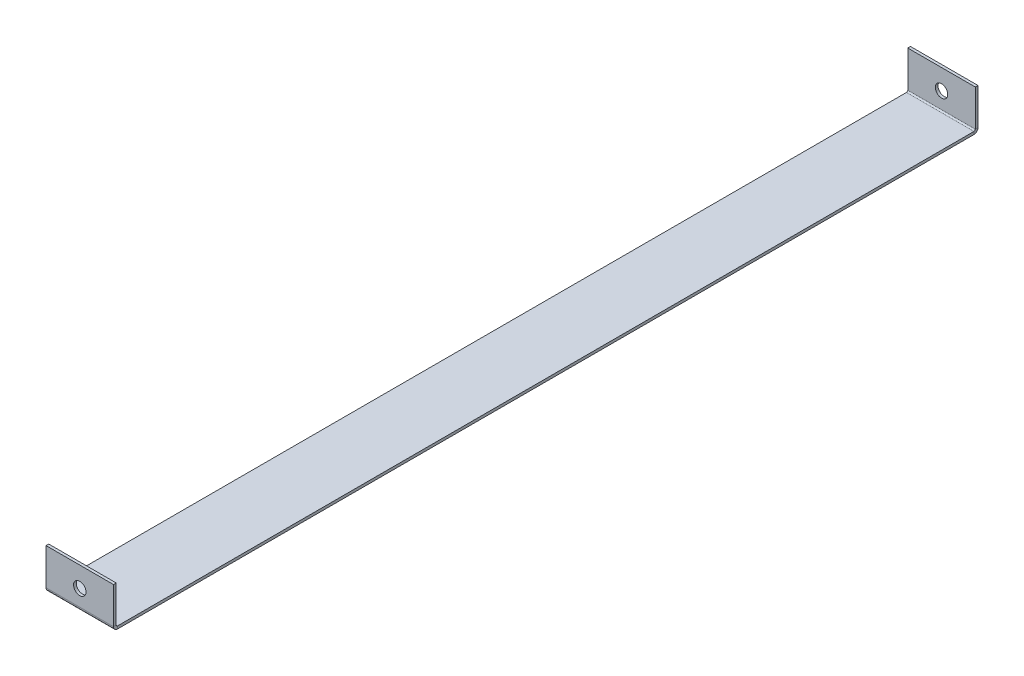
ISO-10303-21;
HEADER;
FILE_DESCRIPTION(('STEP AP214'),'2;1');
FILE_NAME('part.step','',(''),(''),'','','');
FILE_SCHEMA(('AUTOMOTIVE_DESIGN { 1 0 10303 214 1 1 1 1 }'));
ENDSEC;
DATA;
#1=APPLICATION_CONTEXT('core data for automotive mechanical design processes');
#2=APPLICATION_PROTOCOL_DEFINITION('international standard','automotive_design',2000,#1);
#3=PRODUCT_CONTEXT('',#1,'mechanical');
#4=PRODUCT('Part','Part','',(#3));
#5=PRODUCT_RELATED_PRODUCT_CATEGORY('part','',(#4));
#6=PRODUCT_DEFINITION_FORMATION('','',#4);
#7=PRODUCT_DEFINITION_CONTEXT('part definition',#1,'design');
#8=PRODUCT_DEFINITION('design','',#6,#7);
#9=PRODUCT_DEFINITION_SHAPE('','',#8);
#10=(LENGTH_UNIT() NAMED_UNIT(*) SI_UNIT(.MILLI.,.METRE.));
#11=(NAMED_UNIT(*) PLANE_ANGLE_UNIT() SI_UNIT($,.RADIAN.));
#12=(NAMED_UNIT(*) SI_UNIT($,.STERADIAN.) SOLID_ANGLE_UNIT());
#13=UNCERTAINTY_MEASURE_WITH_UNIT(LENGTH_MEASURE(1.E-05),#10,'distance_accuracy_value','');
#14=(GEOMETRIC_REPRESENTATION_CONTEXT(3) GLOBAL_UNCERTAINTY_ASSIGNED_CONTEXT((#13)) GLOBAL_UNIT_ASSIGNED_CONTEXT((#10,
#11,#12)) REPRESENTATION_CONTEXT('',''));
#15=CARTESIAN_POINT('',(0.,0.,0.));
#16=DIRECTION('',(0.,0.,1.));
#17=DIRECTION('',(1.,0.,0.));
#18=AXIS2_PLACEMENT_3D('',#15,#16,#17);
#19=CARTESIAN_POINT('',(-25.,2.,320.));
#20=DIRECTION('',(1.,0.,0.));
#21=DIRECTION('',(0.,0.,-1.));
#22=AXIS2_PLACEMENT_3D('',#19,#20,#21);
#23=PLANE('',#22);
#24=DIRECTION('',(0.,-1.,0.));
#25=VECTOR('',#24,1.);
#26=CARTESIAN_POINT('',(-25.,1.99999999999999,-317.));
#27=LINE('',#26,#25);
#28=CARTESIAN_POINT('',(-25.,2.,-317.));
#29=VERTEX_POINT('',#28);
#30=CARTESIAN_POINT('',(-25.,0.,-317.));
#31=VERTEX_POINT('',#30);
#32=EDGE_CURVE('E213',#29,#31,#27,.T.);
#33=ORIENTED_EDGE('',*,*,#32,.T.);
#34=DIRECTION('',(0.,0.,1.));
#35=VECTOR('',#34,1.);
#36=CARTESIAN_POINT('',(-25.,0.,320.));
#37=LINE('',#36,#35);
#38=CARTESIAN_POINT('',(-25.,0.,317.));
#39=VERTEX_POINT('',#38);
#40=EDGE_CURVE('E277',#31,#39,#37,.T.);
#41=ORIENTED_EDGE('',*,*,#40,.T.);
#42=DIRECTION('',(0.,-1.,0.));
#43=VECTOR('',#42,1.);
#44=CARTESIAN_POINT('',(-25.,2.,317.));
#45=LINE('',#44,#43);
#46=CARTESIAN_POINT('',(-25.,2.,317.));
#47=VERTEX_POINT('',#46);
#48=EDGE_CURVE('E274',#47,#39,#45,.T.);
#49=ORIENTED_EDGE('',*,*,#48,.F.);
#50=DIRECTION('',(0.,0.,1.));
#51=VECTOR('',#50,1.);
#52=CARTESIAN_POINT('',(-25.,2.,320.));
#53=LINE('',#52,#51);
#54=EDGE_CURVE('E82',#29,#47,#53,.T.);
#55=ORIENTED_EDGE('',*,*,#54,.F.);
#56=EDGE_LOOP('',(#33,#41,#49,#55));
#57=FACE_BOUND('',#56,.T.);
#58=ADVANCED_FACE('F74',(#57),#23,.F.);
#59=CARTESIAN_POINT('',(25.,2.,320.));
#60=DIRECTION('',(-1.,0.,0.));
#61=DIRECTION('',(0.,0.,1.));
#62=AXIS2_PLACEMENT_3D('',#59,#60,#61);
#63=PLANE('',#62);
#64=DIRECTION('',(0.,-1.,0.));
#65=VECTOR('',#64,1.);
#66=CARTESIAN_POINT('',(25.,1.99999999999999,-317.));
#67=LINE('',#66,#65);
#68=CARTESIAN_POINT('',(25.,2.,-317.));
#69=VERTEX_POINT('',#68);
#70=CARTESIAN_POINT('',(25.,0.,-317.));
#71=VERTEX_POINT('',#70);
#72=EDGE_CURVE('E90',#69,#71,#67,.T.);
#73=ORIENTED_EDGE('',*,*,#72,.F.);
#74=DIRECTION('',(0.,0.,-1.));
#75=VECTOR('',#74,1.);
#76=CARTESIAN_POINT('',(25.,2.,320.));
#77=LINE('',#76,#75);
#78=CARTESIAN_POINT('',(25.,2.,317.));
#79=VERTEX_POINT('',#78);
#80=EDGE_CURVE('E13',#79,#69,#77,.T.);
#81=ORIENTED_EDGE('',*,*,#80,.F.);
#82=DIRECTION('',(0.,-1.,0.));
#83=VECTOR('',#82,1.);
#84=CARTESIAN_POINT('',(25.,2.,317.));
#85=LINE('',#84,#83);
#86=CARTESIAN_POINT('',(25.,0.,317.));
#87=VERTEX_POINT('',#86);
#88=EDGE_CURVE('E263',#79,#87,#85,.T.);
#89=ORIENTED_EDGE('',*,*,#88,.T.);
#90=DIRECTION('',(0.,0.,-1.));
#91=VECTOR('',#90,1.);
#92=CARTESIAN_POINT('',(25.,0.,320.));
#93=LINE('',#92,#91);
#94=EDGE_CURVE('E279',#87,#71,#93,.T.);
#95=ORIENTED_EDGE('',*,*,#94,.T.);
#96=EDGE_LOOP('',(#73,#81,#89,#95));
#97=FACE_BOUND('',#96,.T.);
#98=ADVANCED_FACE('F282',(#97),#63,.F.);
#99=CARTESIAN_POINT('',(-25.,2.,-320.));
#100=DIRECTION('',(0.,1.,0.));
#101=DIRECTION('',(0.,0.,1.));
#102=AXIS2_PLACEMENT_3D('',#99,#100,#101);
#103=PLANE('',#102);
#104=ORIENTED_EDGE('',*,*,#80,.T.);
#105=DIRECTION('',(-1.,0.,0.));
#106=VECTOR('',#105,1.);
#107=CARTESIAN_POINT('',(-25.,1.99999999999999,-317.));
#108=LINE('',#107,#106);
#109=EDGE_CURVE('E96',#29,#69,#108,.F.);
#110=ORIENTED_EDGE('',*,*,#109,.F.);
#111=ORIENTED_EDGE('',*,*,#54,.T.);
#112=DIRECTION('',(1.,0.,0.));
#113=VECTOR('',#112,1.);
#114=CARTESIAN_POINT('',(25.,2.,317.));
#115=LINE('',#114,#113);
#116=EDGE_CURVE('E269',#79,#47,#115,.F.);
#117=ORIENTED_EDGE('',*,*,#116,.F.);
#118=EDGE_LOOP('',(#104,#110,#111,#117));
#119=FACE_BOUND('',#118,.T.);
#120=ADVANCED_FACE('F374',(#119),#103,.T.);
#121=CARTESIAN_POINT('',(-25.,0.,-320.));
#122=DIRECTION('',(0.,1.,0.));
#123=DIRECTION('',(0.,0.,1.));
#124=AXIS2_PLACEMENT_3D('',#121,#122,#123);
#125=PLANE('',#124);
#126=DIRECTION('',(-1.,0.,0.));
#127=VECTOR('',#126,1.);
#128=CARTESIAN_POINT('',(-25.,0.,-317.));
#129=LINE('',#128,#127);
#130=EDGE_CURVE('E207',#31,#71,#129,.F.);
#131=ORIENTED_EDGE('',*,*,#130,.T.);
#132=ORIENTED_EDGE('',*,*,#94,.F.);
#133=DIRECTION('',(1.,0.,0.));
#134=VECTOR('',#133,1.);
#135=CARTESIAN_POINT('',(25.,0.,317.));
#136=LINE('',#135,#134);
#137=EDGE_CURVE('E256',#87,#39,#136,.F.);
#138=ORIENTED_EDGE('',*,*,#137,.T.);
#139=ORIENTED_EDGE('',*,*,#40,.F.);
#140=EDGE_LOOP('',(#131,#132,#138,#139));
#141=FACE_BOUND('',#140,.T.);
#142=ADVANCED_FACE('F328',(#141),#125,.F.);
#143=CARTESIAN_POINT('',(-25.,3.,317.));
#144=DIRECTION('',(-1.,0.,0.));
#145=DIRECTION('',(0.,0.,1.));
#146=AXIS2_PLACEMENT_3D('',#143,#144,#145);
#147=PLANE('',#146);
#148=DIRECTION('',(0.,0.,-1.));
#149=VECTOR('',#148,1.);
#150=CARTESIAN_POINT('',(-25.,3.,320.));
#151=LINE('',#150,#149);
#152=CARTESIAN_POINT('',(-25.,3.,318.));
#153=VERTEX_POINT('',#152);
#154=CARTESIAN_POINT('',(-25.,3.,320.));
#155=VERTEX_POINT('',#154);
#156=EDGE_CURVE('E224',#153,#155,#151,.F.);
#157=ORIENTED_EDGE('',*,*,#156,.F.);
#158=CARTESIAN_POINT('',(-25.,3.,317.));
#159=DIRECTION('',(1.,0.,0.));
#160=DIRECTION('',(0.,0.,-1.));
#161=AXIS2_PLACEMENT_3D('',#158,#159,#160);
#162=CIRCLE('',#161,1.);
#163=EDGE_CURVE('E266',#47,#153,#162,.F.);
#164=ORIENTED_EDGE('',*,*,#163,.F.);
#165=ORIENTED_EDGE('',*,*,#48,.T.);
#166=CARTESIAN_POINT('',(-25.,3.,317.));
#167=DIRECTION('',(1.,0.,0.));
#168=DIRECTION('',(0.,0.,-1.));
#169=AXIS2_PLACEMENT_3D('',#166,#167,#168);
#170=CIRCLE('',#169,3.);
#171=EDGE_CURVE('E259',#39,#155,#170,.F.);
#172=ORIENTED_EDGE('',*,*,#171,.T.);
#173=EDGE_LOOP('',(#157,#164,#165,#172));
#174=FACE_BOUND('',#173,.T.);
#175=ADVANCED_FACE('F333',(#174),#147,.T.);
#176=CARTESIAN_POINT('',(25.,3.,317.));
#177=DIRECTION('',(-1.,0.,0.));
#178=DIRECTION('',(0.,0.,1.));
#179=AXIS2_PLACEMENT_3D('',#176,#177,#178);
#180=PLANE('',#179);
#181=CARTESIAN_POINT('',(25.,3.,317.));
#182=DIRECTION('',(1.,0.,0.));
#183=DIRECTION('',(0.,0.,-1.));
#184=AXIS2_PLACEMENT_3D('',#181,#182,#183);
#185=CIRCLE('',#184,1.);
#186=CARTESIAN_POINT('',(25.,3.,318.));
#187=VERTEX_POINT('',#186);
#188=EDGE_CURVE('E229',#187,#79,#185,.T.);
#189=ORIENTED_EDGE('',*,*,#188,.F.);
#190=DIRECTION('',(0.,0.,-1.));
#191=VECTOR('',#190,1.);
#192=CARTESIAN_POINT('',(25.,3.,318.));
#193=LINE('',#192,#191);
#194=CARTESIAN_POINT('',(25.,3.,320.));
#195=VERTEX_POINT('',#194);
#196=EDGE_CURVE('E249',#187,#195,#193,.F.);
#197=ORIENTED_EDGE('',*,*,#196,.T.);
#198=CARTESIAN_POINT('',(25.,3.,317.));
#199=DIRECTION('',(1.,0.,0.));
#200=DIRECTION('',(0.,0.,-1.));
#201=AXIS2_PLACEMENT_3D('',#198,#199,#200);
#202=CIRCLE('',#201,3.);
#203=EDGE_CURVE('E260',#195,#87,#202,.T.);
#204=ORIENTED_EDGE('',*,*,#203,.T.);
#205=ORIENTED_EDGE('',*,*,#88,.F.);
#206=EDGE_LOOP('',(#189,#197,#204,#205));
#207=FACE_BOUND('',#206,.T.);
#208=ADVANCED_FACE('F382',(#207),#180,.F.);
#209=CARTESIAN_POINT('',(25.,3.,317.));
#210=DIRECTION('',(1.,0.,0.));
#211=DIRECTION('',(0.,0.,1.));
#212=AXIS2_PLACEMENT_3D('',#209,#210,#211);
#213=CYLINDRICAL_SURFACE('',#212,3.);
#214=ORIENTED_EDGE('',*,*,#137,.F.);
#215=ORIENTED_EDGE('',*,*,#203,.F.);
#216=DIRECTION('',(1.,0.,0.));
#217=VECTOR('',#216,1.);
#218=CARTESIAN_POINT('',(-25.,3.,320.));
#219=LINE('',#218,#217);
#220=EDGE_CURVE('E247',#195,#155,#219,.F.);
#221=ORIENTED_EDGE('',*,*,#220,.T.);
#222=ORIENTED_EDGE('',*,*,#171,.F.);
#223=EDGE_LOOP('',(#214,#215,#221,#222));
#224=FACE_BOUND('',#223,.T.);
#225=ADVANCED_FACE('F334',(#224),#213,.T.);
#226=CARTESIAN_POINT('',(25.,3.,317.));
#227=DIRECTION('',(1.,0.,0.));
#228=DIRECTION('',(0.,0.,1.));
#229=AXIS2_PLACEMENT_3D('',#226,#227,#228);
#230=CYLINDRICAL_SURFACE('',#229,1.);
#231=ORIENTED_EDGE('',*,*,#116,.T.);
#232=ORIENTED_EDGE('',*,*,#163,.T.);
#233=DIRECTION('',(1.,0.,0.));
#234=VECTOR('',#233,1.);
#235=CARTESIAN_POINT('',(-25.,3.,318.));
#236=LINE('',#235,#234);
#237=EDGE_CURVE('E252',#153,#187,#236,.T.);
#238=ORIENTED_EDGE('',*,*,#237,.T.);
#239=ORIENTED_EDGE('',*,*,#188,.T.);
#240=EDGE_LOOP('',(#231,#232,#238,#239));
#241=FACE_BOUND('',#240,.T.);
#242=ADVANCED_FACE('F355',(#241),#230,.F.);
#243=CARTESIAN_POINT('',(-25.,2.,320.));
#244=DIRECTION('',(1.,0.,0.));
#245=DIRECTION('',(0.,1.,0.));
#246=AXIS2_PLACEMENT_3D('',#243,#244,#245);
#247=PLANE('',#246);
#248=ORIENTED_EDGE('',*,*,#156,.T.);
#249=DIRECTION('',(0.,-1.,0.));
#250=VECTOR('',#249,1.);
#251=CARTESIAN_POINT('',(-25.,30.,320.));
#252=LINE('',#251,#250);
#253=CARTESIAN_POINT('',(-25.,30.,320.));
#254=VERTEX_POINT('',#253);
#255=EDGE_CURVE('E237',#254,#155,#252,.T.);
#256=ORIENTED_EDGE('',*,*,#255,.F.);
#257=DIRECTION('',(0.,0.,-1.));
#258=VECTOR('',#257,1.);
#259=CARTESIAN_POINT('',(-25.,30.,320.));
#260=LINE('',#259,#258);
#261=CARTESIAN_POINT('',(-25.,30.,318.));
#262=VERTEX_POINT('',#261);
#263=EDGE_CURVE('E230',#254,#262,#260,.T.);
#264=ORIENTED_EDGE('',*,*,#263,.T.);
#265=DIRECTION('',(0.,1.,0.));
#266=VECTOR('',#265,1.);
#267=CARTESIAN_POINT('',(-25.,2.,318.));
#268=LINE('',#267,#266);
#269=EDGE_CURVE('E244',#262,#153,#268,.F.);
#270=ORIENTED_EDGE('',*,*,#269,.T.);
#271=EDGE_LOOP('',(#248,#256,#264,#270));
#272=FACE_BOUND('',#271,.T.);
#273=ADVANCED_FACE('F352',(#272),#247,.F.);
#274=CARTESIAN_POINT('',(25.,30.,320.));
#275=DIRECTION('',(-1.,0.,0.));
#276=DIRECTION('',(0.,-1.,0.));
#277=AXIS2_PLACEMENT_3D('',#274,#275,#276);
#278=PLANE('',#277);
#279=ORIENTED_EDGE('',*,*,#196,.F.);
#280=DIRECTION('',(0.,-1.,0.));
#281=VECTOR('',#280,1.);
#282=CARTESIAN_POINT('',(25.,30.,318.));
#283=LINE('',#282,#281);
#284=CARTESIAN_POINT('',(25.,30.,318.));
#285=VERTEX_POINT('',#284);
#286=EDGE_CURVE('E242',#187,#285,#283,.F.);
#287=ORIENTED_EDGE('',*,*,#286,.T.);
#288=DIRECTION('',(0.,0.,-1.));
#289=VECTOR('',#288,1.);
#290=CARTESIAN_POINT('',(25.,30.,320.));
#291=LINE('',#290,#289);
#292=CARTESIAN_POINT('',(25.,30.,320.));
#293=VERTEX_POINT('',#292);
#294=EDGE_CURVE('E226',#293,#285,#291,.T.);
#295=ORIENTED_EDGE('',*,*,#294,.F.);
#296=DIRECTION('',(0.,1.,0.));
#297=VECTOR('',#296,1.);
#298=CARTESIAN_POINT('',(25.,30.,320.));
#299=LINE('',#298,#297);
#300=EDGE_CURVE('E235',#195,#293,#299,.T.);
#301=ORIENTED_EDGE('',*,*,#300,.F.);
#302=EDGE_LOOP('',(#279,#287,#295,#301));
#303=FACE_BOUND('',#302,.T.);
#304=ADVANCED_FACE('F343',(#303),#278,.F.);
#305=CARTESIAN_POINT('',(-25.,30.,320.));
#306=DIRECTION('',(0.,0.,-1.));
#307=DIRECTION('',(-1.,0.,0.));
#308=AXIS2_PLACEMENT_3D('',#305,#306,#307);
#309=PLANE('',#308);
#310=CARTESIAN_POINT('',(0.,15.,320.));
#311=DIRECTION('',(0.,0.,1.));
#312=DIRECTION('',(1.,0.,0.));
#313=AXIS2_PLACEMENT_3D('',#310,#311,#312);
#314=CIRCLE('',#313,4.6);
#315=CARTESIAN_POINT('',(4.6,15.,320.));
#316=VERTEX_POINT('',#315);
#317=EDGE_CURVE('E301',#316,#316,#314,.T.);
#318=ORIENTED_EDGE('',*,*,#317,.F.);
#319=EDGE_LOOP('',(#318));
#320=FACE_BOUND('',#319,.T.);
#321=ORIENTED_EDGE('',*,*,#220,.F.);
#322=ORIENTED_EDGE('',*,*,#300,.T.);
#323=DIRECTION('',(-1.,0.,0.));
#324=VECTOR('',#323,1.);
#325=CARTESIAN_POINT('',(-25.,30.,320.));
#326=LINE('',#325,#324);
#327=EDGE_CURVE('E233',#293,#254,#326,.T.);
#328=ORIENTED_EDGE('',*,*,#327,.T.);
#329=ORIENTED_EDGE('',*,*,#255,.T.);
#330=EDGE_LOOP('',(#321,#322,#328,#329));
#331=FACE_BOUND('',#330,.T.);
#332=ADVANCED_FACE('F338',(#320,#331),#309,.F.);
#333=CARTESIAN_POINT('',(-25.,30.,318.));
#334=DIRECTION('',(0.,0.,-1.));
#335=DIRECTION('',(-1.,0.,0.));
#336=AXIS2_PLACEMENT_3D('',#333,#334,#335);
#337=PLANE('',#336);
#338=CARTESIAN_POINT('',(0.,15.,318.));
#339=DIRECTION('',(0.,0.,-1.));
#340=DIRECTION('',(-1.,0.,0.));
#341=AXIS2_PLACEMENT_3D('',#338,#339,#340);
#342=CIRCLE('',#341,4.6);
#343=CARTESIAN_POINT('',(-4.6,15.,318.));
#344=VERTEX_POINT('',#343);
#345=EDGE_CURVE('E206',#344,#344,#342,.T.);
#346=ORIENTED_EDGE('',*,*,#345,.F.);
#347=EDGE_LOOP('',(#346));
#348=FACE_BOUND('',#347,.T.);
#349=ORIENTED_EDGE('',*,*,#286,.F.);
#350=ORIENTED_EDGE('',*,*,#237,.F.);
#351=ORIENTED_EDGE('',*,*,#269,.F.);
#352=DIRECTION('',(1.,0.,0.));
#353=VECTOR('',#352,1.);
#354=CARTESIAN_POINT('',(-25.,30.,318.));
#355=LINE('',#354,#353);
#356=EDGE_CURVE('E240',#285,#262,#355,.F.);
#357=ORIENTED_EDGE('',*,*,#356,.F.);
#358=EDGE_LOOP('',(#349,#350,#351,#357));
#359=FACE_BOUND('',#358,.T.);
#360=ADVANCED_FACE('F358',(#348,#359),#337,.T.);
#361=CARTESIAN_POINT('',(-25.,30.,320.));
#362=DIRECTION('',(0.,-1.,0.));
#363=DIRECTION('',(0.,0.,-1.));
#364=AXIS2_PLACEMENT_3D('',#361,#362,#363);
#365=PLANE('',#364);
#366=ORIENTED_EDGE('',*,*,#356,.T.);
#367=ORIENTED_EDGE('',*,*,#263,.F.);
#368=ORIENTED_EDGE('',*,*,#327,.F.);
#369=ORIENTED_EDGE('',*,*,#294,.T.);
#370=EDGE_LOOP('',(#366,#367,#368,#369));
#371=FACE_BOUND('',#370,.T.);
#372=ADVANCED_FACE('F349',(#371),#365,.F.);
#373=CARTESIAN_POINT('',(25.,3.,-317.));
#374=DIRECTION('',(1.,0.,0.));
#375=DIRECTION('',(0.,0.,-1.));
#376=AXIS2_PLACEMENT_3D('',#373,#374,#375);
#377=PLANE('',#376);
#378=DIRECTION('',(0.,0.,1.));
#379=VECTOR('',#378,1.);
#380=CARTESIAN_POINT('',(25.,3.00000000000002,-320.));
#381=LINE('',#380,#379);
#382=CARTESIAN_POINT('',(25.,2.99999999999999,-318.));
#383=VERTEX_POINT('',#382);
#384=CARTESIAN_POINT('',(25.,2.99999999999998,-320.));
#385=VERTEX_POINT('',#384);
#386=EDGE_CURVE('E189',#383,#385,#381,.F.);
#387=ORIENTED_EDGE('',*,*,#386,.F.);
#388=CARTESIAN_POINT('',(25.,3.,-317.));
#389=DIRECTION('',(-1.,0.,0.));
#390=DIRECTION('',(0.,0.,1.));
#391=AXIS2_PLACEMENT_3D('',#388,#389,#390);
#392=CIRCLE('',#391,1.);
#393=EDGE_CURVE('E216',#69,#383,#392,.F.);
#394=ORIENTED_EDGE('',*,*,#393,.F.);
#395=ORIENTED_EDGE('',*,*,#72,.T.);
#396=CARTESIAN_POINT('',(25.,3.,-317.));
#397=DIRECTION('',(-1.,0.,0.));
#398=DIRECTION('',(0.,0.,1.));
#399=AXIS2_PLACEMENT_3D('',#396,#397,#398);
#400=CIRCLE('',#399,3.);
#401=EDGE_CURVE('E209',#71,#385,#400,.F.);
#402=ORIENTED_EDGE('',*,*,#401,.T.);
#403=EDGE_LOOP('',(#387,#394,#395,#402));
#404=FACE_BOUND('',#403,.T.);
#405=ADVANCED_FACE('F289',(#404),#377,.T.);
#406=CARTESIAN_POINT('',(-25.,3.,-317.));
#407=DIRECTION('',(1.,0.,0.));
#408=DIRECTION('',(0.,0.,-1.));
#409=AXIS2_PLACEMENT_3D('',#406,#407,#408);
#410=PLANE('',#409);
#411=CARTESIAN_POINT('',(-25.,3.,-317.));
#412=DIRECTION('',(-1.,0.,0.));
#413=DIRECTION('',(0.,0.,1.));
#414=AXIS2_PLACEMENT_3D('',#411,#412,#413);
#415=CIRCLE('',#414,1.);
#416=CARTESIAN_POINT('',(-25.,2.99999999999999,-318.));
#417=VERTEX_POINT('',#416);
#418=EDGE_CURVE('E220',#417,#29,#415,.T.);
#419=ORIENTED_EDGE('',*,*,#418,.F.);
#420=DIRECTION('',(0.,0.,1.));
#421=VECTOR('',#420,1.);
#422=CARTESIAN_POINT('',(-25.,3.,-318.));
#423=LINE('',#422,#421);
#424=CARTESIAN_POINT('',(-25.,3.00000000000002,-320.));
#425=VERTEX_POINT('',#424);
#426=EDGE_CURVE('E200',#417,#425,#423,.F.);
#427=ORIENTED_EDGE('',*,*,#426,.T.);
#428=CARTESIAN_POINT('',(-25.,3.,-317.));
#429=DIRECTION('',(-1.,0.,0.));
#430=DIRECTION('',(0.,0.,1.));
#431=AXIS2_PLACEMENT_3D('',#428,#429,#430);
#432=CIRCLE('',#431,3.);
#433=EDGE_CURVE('E210',#425,#31,#432,.T.);
#434=ORIENTED_EDGE('',*,*,#433,.T.);
#435=ORIENTED_EDGE('',*,*,#32,.F.);
#436=EDGE_LOOP('',(#419,#427,#434,#435));
#437=FACE_BOUND('',#436,.T.);
#438=ADVANCED_FACE('F324',(#437),#410,.F.);
#439=CARTESIAN_POINT('',(-25.,3.,-317.));
#440=DIRECTION('',(-1.,0.,0.));
#441=DIRECTION('',(0.,0.,-1.));
#442=AXIS2_PLACEMENT_3D('',#439,#440,#441);
#443=CYLINDRICAL_SURFACE('',#442,3.);
#444=ORIENTED_EDGE('',*,*,#130,.F.);
#445=ORIENTED_EDGE('',*,*,#433,.F.);
#446=DIRECTION('',(-1.,0.,0.));
#447=VECTOR('',#446,1.);
#448=CARTESIAN_POINT('',(25.,3.00000000000002,-320.));
#449=LINE('',#448,#447);
#450=EDGE_CURVE('E198',#425,#385,#449,.F.);
#451=ORIENTED_EDGE('',*,*,#450,.T.);
#452=ORIENTED_EDGE('',*,*,#401,.F.);
#453=EDGE_LOOP('',(#444,#445,#451,#452));
#454=FACE_BOUND('',#453,.T.);
#455=ADVANCED_FACE('F292',(#454),#443,.T.);
#456=CARTESIAN_POINT('',(-25.,3.,-317.));
#457=DIRECTION('',(-1.,0.,0.));
#458=DIRECTION('',(0.,0.,-1.));
#459=AXIS2_PLACEMENT_3D('',#456,#457,#458);
#460=CYLINDRICAL_SURFACE('',#459,1.);
#461=ORIENTED_EDGE('',*,*,#109,.T.);
#462=ORIENTED_EDGE('',*,*,#393,.T.);
#463=DIRECTION('',(-1.,0.,0.));
#464=VECTOR('',#463,1.);
#465=CARTESIAN_POINT('',(25.,3.,-318.));
#466=LINE('',#465,#464);
#467=EDGE_CURVE('E203',#383,#417,#466,.T.);
#468=ORIENTED_EDGE('',*,*,#467,.T.);
#469=ORIENTED_EDGE('',*,*,#418,.T.);
#470=EDGE_LOOP('',(#461,#462,#468,#469));
#471=FACE_BOUND('',#470,.T.);
#472=ADVANCED_FACE('F321',(#471),#460,.F.);
#473=CARTESIAN_POINT('',(25.,1.99999999999999,-320.));
#474=DIRECTION('',(-1.,0.,0.));
#475=DIRECTION('',(0.,0.,1.));
#476=AXIS2_PLACEMENT_3D('',#473,#474,#475);
#477=PLANE('',#476);
#478=ORIENTED_EDGE('',*,*,#386,.T.);
#479=DIRECTION('',(0.,-1.,0.));
#480=VECTOR('',#479,1.);
#481=CARTESIAN_POINT('',(25.,30.,-320.));
#482=LINE('',#481,#480);
#483=CARTESIAN_POINT('',(25.,30.,-320.));
#484=VERTEX_POINT('',#483);
#485=EDGE_CURVE('E170',#484,#385,#482,.T.);
#486=ORIENTED_EDGE('',*,*,#485,.F.);
#487=DIRECTION('',(0.,0.,1.));
#488=VECTOR('',#487,1.);
#489=CARTESIAN_POINT('',(25.,30.,-320.));
#490=LINE('',#489,#488);
#491=CARTESIAN_POINT('',(25.,30.,-318.));
#492=VERTEX_POINT('',#491);
#493=EDGE_CURVE('E176',#484,#492,#490,.T.);
#494=ORIENTED_EDGE('',*,*,#493,.T.);
#495=DIRECTION('',(0.,1.,0.));
#496=VECTOR('',#495,1.);
#497=CARTESIAN_POINT('',(25.,2.,-318.));
#498=LINE('',#497,#496);
#499=EDGE_CURVE('E196',#492,#383,#498,.F.);
#500=ORIENTED_EDGE('',*,*,#499,.T.);
#501=EDGE_LOOP('',(#478,#486,#494,#500));
#502=FACE_BOUND('',#501,.T.);
#503=ADVANCED_FACE('F188',(#502),#477,.F.);
#504=CARTESIAN_POINT('',(-25.,30.,-320.));
#505=DIRECTION('',(1.,0.,0.));
#506=DIRECTION('',(0.,0.,-1.));
#507=AXIS2_PLACEMENT_3D('',#504,#505,#506);
#508=PLANE('',#507);
#509=ORIENTED_EDGE('',*,*,#426,.F.);
#510=DIRECTION('',(0.,-1.,0.));
#511=VECTOR('',#510,1.);
#512=CARTESIAN_POINT('',(-25.,30.,-318.));
#513=LINE('',#512,#511);
#514=CARTESIAN_POINT('',(-25.,30.,-318.));
#515=VERTEX_POINT('',#514);
#516=EDGE_CURVE('E192',#417,#515,#513,.F.);
#517=ORIENTED_EDGE('',*,*,#516,.T.);
#518=DIRECTION('',(0.,0.,1.));
#519=VECTOR('',#518,1.);
#520=CARTESIAN_POINT('',(-25.,30.,-320.));
#521=LINE('',#520,#519);
#522=CARTESIAN_POINT('',(-25.,30.,-320.));
#523=VERTEX_POINT('',#522);
#524=EDGE_CURVE('E185',#523,#515,#521,.T.);
#525=ORIENTED_EDGE('',*,*,#524,.F.);
#526=DIRECTION('',(0.,1.,0.));
#527=VECTOR('',#526,1.);
#528=CARTESIAN_POINT('',(-25.,30.,-320.));
#529=LINE('',#528,#527);
#530=EDGE_CURVE('E172',#425,#523,#529,.T.);
#531=ORIENTED_EDGE('',*,*,#530,.F.);
#532=EDGE_LOOP('',(#509,#517,#525,#531));
#533=FACE_BOUND('',#532,.T.);
#534=ADVANCED_FACE('F295',(#533),#508,.F.);
#535=CARTESIAN_POINT('',(25.,30.,-320.));
#536=DIRECTION('',(0.,0.,1.));
#537=DIRECTION('',(0.,-1.,0.));
#538=AXIS2_PLACEMENT_3D('',#535,#536,#537);
#539=PLANE('',#538);
#540=CARTESIAN_POINT('',(0.,15.,-320.));
#541=DIRECTION('',(0.,0.,1.));
#542=DIRECTION('',(1.,0.,0.));
#543=AXIS2_PLACEMENT_3D('',#540,#541,#542);
#544=CIRCLE('',#543,4.6);
#545=CARTESIAN_POINT('',(4.6,15.,-320.));
#546=VERTEX_POINT('',#545);
#547=EDGE_CURVE('E304',#546,#546,#544,.T.);
#548=ORIENTED_EDGE('',*,*,#547,.T.);
#549=EDGE_LOOP('',(#548));
#550=FACE_BOUND('',#549,.T.);
#551=ORIENTED_EDGE('',*,*,#450,.F.);
#552=ORIENTED_EDGE('',*,*,#530,.T.);
#553=DIRECTION('',(1.,0.,0.));
#554=VECTOR('',#553,1.);
#555=CARTESIAN_POINT('',(25.,30.,-320.));
#556=LINE('',#555,#554);
#557=EDGE_CURVE('E165',#523,#484,#556,.T.);
#558=ORIENTED_EDGE('',*,*,#557,.T.);
#559=ORIENTED_EDGE('',*,*,#485,.T.);
#560=EDGE_LOOP('',(#551,#552,#558,#559));
#561=FACE_BOUND('',#560,.T.);
#562=ADVANCED_FACE('F168',(#550,#561),#539,.F.);
#563=CARTESIAN_POINT('',(25.,30.,-318.));
#564=DIRECTION('',(0.,0.,1.));
#565=DIRECTION('',(0.,-1.,0.));
#566=AXIS2_PLACEMENT_3D('',#563,#564,#565);
#567=PLANE('',#566);
#568=CARTESIAN_POINT('',(0.,15.,-318.));
#569=DIRECTION('',(0.,0.,1.));
#570=DIRECTION('',(0.,-1.,0.));
#571=AXIS2_PLACEMENT_3D('',#568,#569,#570);
#572=CIRCLE('',#571,4.6);
#573=CARTESIAN_POINT('',(0.,10.4,-318.));
#574=VERTEX_POINT('',#573);
#575=EDGE_CURVE('E77',#574,#574,#572,.T.);
#576=ORIENTED_EDGE('',*,*,#575,.F.);
#577=EDGE_LOOP('',(#576));
#578=FACE_BOUND('',#577,.T.);
#579=ORIENTED_EDGE('',*,*,#516,.F.);
#580=ORIENTED_EDGE('',*,*,#467,.F.);
#581=ORIENTED_EDGE('',*,*,#499,.F.);
#582=DIRECTION('',(-1.,0.,0.));
#583=VECTOR('',#582,1.);
#584=CARTESIAN_POINT('',(25.,30.,-318.));
#585=LINE('',#584,#583);
#586=EDGE_CURVE('E181',#515,#492,#585,.F.);
#587=ORIENTED_EDGE('',*,*,#586,.F.);
#588=EDGE_LOOP('',(#579,#580,#581,#587));
#589=FACE_BOUND('',#588,.T.);
#590=ADVANCED_FACE('F314',(#578,#589),#567,.T.);
#591=CARTESIAN_POINT('',(25.,30.,-320.));
#592=DIRECTION('',(0.,-1.,0.));
#593=DIRECTION('',(0.,0.,-1.));
#594=AXIS2_PLACEMENT_3D('',#591,#592,#593);
#595=PLANE('',#594);
#596=ORIENTED_EDGE('',*,*,#586,.T.);
#597=ORIENTED_EDGE('',*,*,#493,.F.);
#598=ORIENTED_EDGE('',*,*,#557,.F.);
#599=ORIENTED_EDGE('',*,*,#524,.T.);
#600=EDGE_LOOP('',(#596,#597,#598,#599));
#601=FACE_BOUND('',#600,.T.);
#602=ADVANCED_FACE('F179',(#601),#595,.F.);
#603=CARTESIAN_POINT('',(0.,15.,-320.));
#604=DIRECTION('',(0.,0.,1.));
#605=DIRECTION('',(1.,0.,0.));
#606=AXIS2_PLACEMENT_3D('',#603,#604,#605);
#607=CYLINDRICAL_SURFACE('',#606,4.6);
#608=ORIENTED_EDGE('',*,*,#575,.T.);
#609=EDGE_LOOP('',(#608));
#610=FACE_BOUND('',#609,.T.);
#611=ORIENTED_EDGE('',*,*,#547,.F.);
#612=EDGE_LOOP('',(#611));
#613=FACE_BOUND('',#612,.T.);
#614=ADVANCED_FACE('F311',(#610,#613),#607,.F.);
#615=ORIENTED_EDGE('',*,*,#345,.T.);
#616=EDGE_LOOP('',(#615));
#617=FACE_BOUND('',#616,.T.);
#618=ORIENTED_EDGE('',*,*,#317,.T.);
#619=EDGE_LOOP('',(#618));
#620=FACE_BOUND('',#619,.T.);
#621=ADVANCED_FACE('F443',(#617,#620),#607,.F.);
#622=CLOSED_SHELL('',(#58,#98,#120,#142,#175,#208,#225,#242,#273,#304,#332,#360,#372,#405,#438,
#455,#472,#503,#534,#562,#590,#602,#614,#621));
#623=MANIFOLD_SOLID_BREP('B2',#622);
#624=ADVANCED_BREP_SHAPE_REPRESENTATION('',(#18,#623),#14);
#625=SHAPE_DEFINITION_REPRESENTATION(#9,#624);
ENDSEC;
END-ISO-10303-21;
